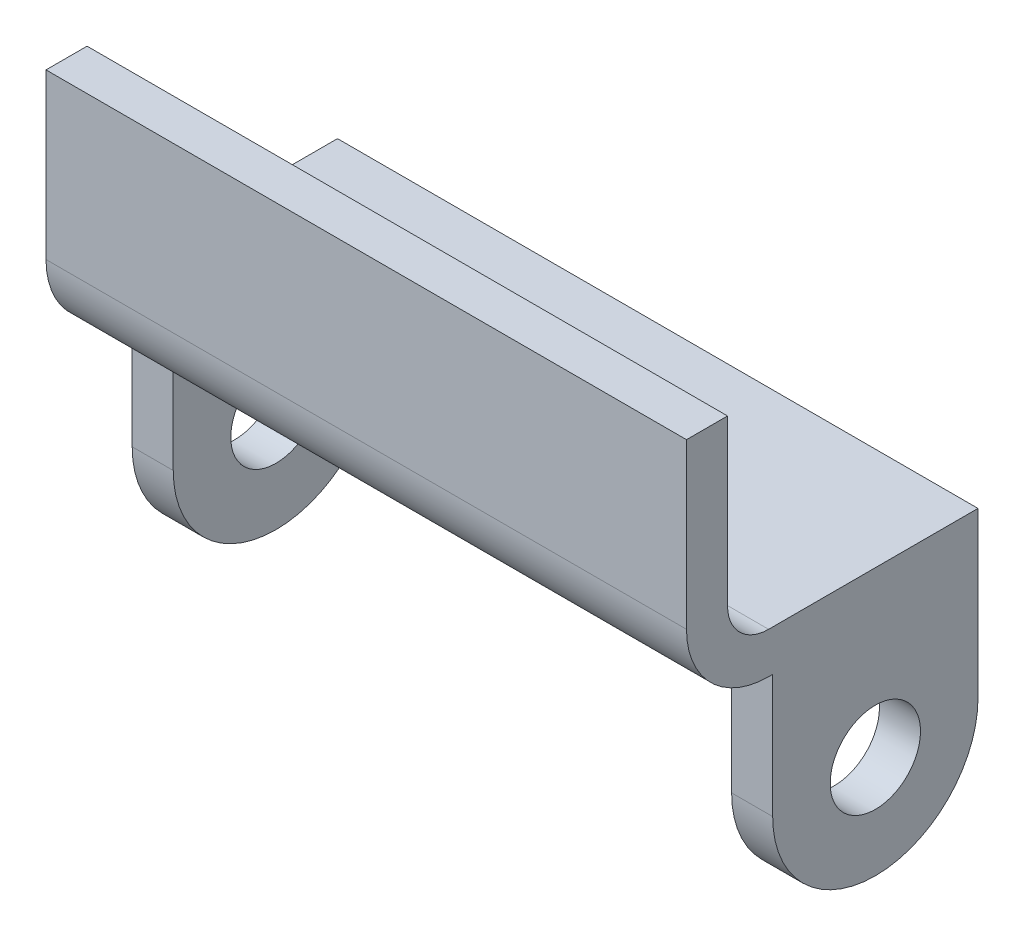
ISO-10303-21;
HEADER;
FILE_DESCRIPTION(('STEP AP214'),'2;1');
FILE_NAME('part.step','',(''),(''),'','','');
FILE_SCHEMA(('AUTOMOTIVE_DESIGN { 1 0 10303 214 1 1 1 1 }'));
ENDSEC;
DATA;
#1=APPLICATION_CONTEXT('core data for automotive mechanical design processes');
#2=APPLICATION_PROTOCOL_DEFINITION('international standard','automotive_design',2000,#1);
#3=PRODUCT_CONTEXT('',#1,'mechanical');
#4=PRODUCT('Part','Part','',(#3));
#5=PRODUCT_RELATED_PRODUCT_CATEGORY('part','',(#4));
#6=PRODUCT_DEFINITION_FORMATION('','',#4);
#7=PRODUCT_DEFINITION_CONTEXT('part definition',#1,'design');
#8=PRODUCT_DEFINITION('design','',#6,#7);
#9=PRODUCT_DEFINITION_SHAPE('','',#8);
#10=(LENGTH_UNIT() NAMED_UNIT(*) SI_UNIT(.MILLI.,.METRE.));
#11=(NAMED_UNIT(*) PLANE_ANGLE_UNIT() SI_UNIT($,.RADIAN.));
#12=(NAMED_UNIT(*) SI_UNIT($,.STERADIAN.) SOLID_ANGLE_UNIT());
#13=UNCERTAINTY_MEASURE_WITH_UNIT(LENGTH_MEASURE(1.E-05),#10,'distance_accuracy_value','');
#14=(GEOMETRIC_REPRESENTATION_CONTEXT(3) GLOBAL_UNCERTAINTY_ASSIGNED_CONTEXT((#13)) GLOBAL_UNIT_ASSIGNED_CONTEXT((#10,
#11,#12)) REPRESENTATION_CONTEXT('',''));
#15=CARTESIAN_POINT('',(0.,0.,0.));
#16=DIRECTION('',(0.,0.,1.));
#17=DIRECTION('',(1.,0.,0.));
#18=AXIS2_PLACEMENT_3D('',#15,#16,#17);
#19=CARTESIAN_POINT('',(39.,-186.635856384961,0.));
#20=DIRECTION('',(0.,1.,0.));
#21=DIRECTION('',(0.,0.,1.));
#22=AXIS2_PLACEMENT_3D('',#19,#20,#21);
#23=PLANE('',#22);
#24=DIRECTION('',(0.,0.,1.));
#25=VECTOR('',#24,1.);
#26=CARTESIAN_POINT('',(-34.,-186.635856384961,0.));
#27=LINE('',#26,#25);
#28=CARTESIAN_POINT('',(-34.,-186.635856384961,-115.093365073489));
#29=VERTEX_POINT('',#28);
#30=CARTESIAN_POINT('',(-34.,-186.635856384961,-90.0887830829173));
#31=VERTEX_POINT('',#30);
#32=EDGE_CURVE('E58',#29,#31,#27,.T.);
#33=ORIENTED_EDGE('',*,*,#32,.F.);
#34=DIRECTION('',(-1.,0.,0.));
#35=VECTOR('',#34,1.);
#36=CARTESIAN_POINT('',(39.,-186.635856384961,-115.093365073489));
#37=LINE('',#36,#35);
#38=CARTESIAN_POINT('',(34.,-186.635856384961,-115.093365073489));
#39=VERTEX_POINT('',#38);
#40=EDGE_CURVE('E161',#39,#29,#37,.T.);
#41=ORIENTED_EDGE('',*,*,#40,.F.);
#42=DIRECTION('',(0.,0.,-1.));
#43=VECTOR('',#42,1.);
#44=CARTESIAN_POINT('',(34.,-186.635856384961,0.));
#45=LINE('',#44,#43);
#46=CARTESIAN_POINT('',(34.,-186.635856384961,-90.0887830829173));
#47=VERTEX_POINT('',#46);
#48=EDGE_CURVE('E259',#47,#39,#45,.T.);
#49=ORIENTED_EDGE('',*,*,#48,.F.);
#50=DIRECTION('',(1.,0.,0.));
#51=VECTOR('',#50,1.);
#52=CARTESIAN_POINT('',(39.,-186.635856384961,-90.0887830829173));
#53=LINE('',#52,#51);
#54=CARTESIAN_POINT('',(39.,-186.635856384961,-90.0887830829173));
#55=VERTEX_POINT('',#54);
#56=EDGE_CURVE('E51',#47,#55,#53,.T.);
#57=ORIENTED_EDGE('',*,*,#56,.T.);
#58=DIRECTION('',(0.,0.,-1.));
#59=VECTOR('',#58,1.);
#60=CARTESIAN_POINT('',(39.,-186.635856384961,0.));
#61=LINE('',#60,#59);
#62=CARTESIAN_POINT('',(39.,-186.635856384961,-89.5933650734886));
#63=VERTEX_POINT('',#62);
#64=EDGE_CURVE('E210',#63,#55,#61,.T.);
#65=ORIENTED_EDGE('',*,*,#64,.F.);
#66=DIRECTION('',(-1.,0.,0.));
#67=VECTOR('',#66,1.);
#68=CARTESIAN_POINT('',(39.,-186.635856384961,-89.5933650734886));
#69=LINE('',#68,#67);
#70=CARTESIAN_POINT('',(-39.,-186.635856384961,-89.5933650734886));
#71=VERTEX_POINT('',#70);
#72=EDGE_CURVE('E255',#63,#71,#69,.T.);
#73=ORIENTED_EDGE('',*,*,#72,.T.);
#74=DIRECTION('',(0.,0.,-1.));
#75=VECTOR('',#74,1.);
#76=CARTESIAN_POINT('',(-39.,-186.635856384961,0.));
#77=LINE('',#76,#75);
#78=CARTESIAN_POINT('',(-39.,-186.635856384961,-90.0887830829173));
#79=VERTEX_POINT('',#78);
#80=EDGE_CURVE('E227',#71,#79,#77,.T.);
#81=ORIENTED_EDGE('',*,*,#80,.T.);
#82=DIRECTION('',(-1.,0.,0.));
#83=VECTOR('',#82,1.);
#84=CARTESIAN_POINT('',(39.,-186.635856384961,-90.0887830829173));
#85=LINE('',#84,#83);
#86=EDGE_CURVE('E11',#31,#79,#85,.T.);
#87=ORIENTED_EDGE('',*,*,#86,.F.);
#88=EDGE_LOOP('',(#33,#41,#49,#57,#65,#73,#81,#87));
#89=FACE_BOUND('',#88,.T.);
#90=ADVANCED_FACE('F43',(#89),#23,.F.);
#91=CARTESIAN_POINT('',(39.,0.,-79.5933650734886));
#92=DIRECTION('',(0.,0.,-1.));
#93=DIRECTION('',(-1.,0.,0.));
#94=AXIS2_PLACEMENT_3D('',#91,#92,#93);
#95=PLANE('',#94);
#96=DIRECTION('',(0.,-1.,0.));
#97=VECTOR('',#96,1.);
#98=CARTESIAN_POINT('',(-39.,0.,-79.5933650734886));
#99=LINE('',#98,#97);
#100=CARTESIAN_POINT('',(-39.,-156.635856384961,-79.5933650734886));
#101=VERTEX_POINT('',#100);
#102=CARTESIAN_POINT('',(-39.,-176.635856384961,-79.5933650734886));
#103=VERTEX_POINT('',#102);
#104=EDGE_CURVE('E197',#101,#103,#99,.T.);
#105=ORIENTED_EDGE('',*,*,#104,.T.);
#106=DIRECTION('',(-1.,0.,0.));
#107=VECTOR('',#106,1.);
#108=CARTESIAN_POINT('',(39.,-176.635856384961,-79.5933650734886));
#109=LINE('',#108,#107);
#110=CARTESIAN_POINT('',(39.,-176.635856384961,-79.5933650734886));
#111=VERTEX_POINT('',#110);
#112=EDGE_CURVE('E253',#111,#103,#109,.T.);
#113=ORIENTED_EDGE('',*,*,#112,.F.);
#114=DIRECTION('',(0.,-1.,0.));
#115=VECTOR('',#114,1.);
#116=CARTESIAN_POINT('',(39.,0.,-79.5933650734886));
#117=LINE('',#116,#115);
#118=CARTESIAN_POINT('',(39.,-156.635856384961,-79.5933650734886));
#119=VERTEX_POINT('',#118);
#120=EDGE_CURVE('E204',#119,#111,#117,.T.);
#121=ORIENTED_EDGE('',*,*,#120,.F.);
#122=DIRECTION('',(-1.,0.,0.));
#123=VECTOR('',#122,1.);
#124=CARTESIAN_POINT('',(39.,-156.635856384961,-79.5933650734886));
#125=LINE('',#124,#123);
#126=EDGE_CURVE('E221',#119,#101,#125,.T.);
#127=ORIENTED_EDGE('',*,*,#126,.T.);
#128=EDGE_LOOP('',(#105,#113,#121,#127));
#129=FACE_BOUND('',#128,.T.);
#130=ADVANCED_FACE('F44',(#129),#95,.F.);
#131=CARTESIAN_POINT('',(39.,-176.635856384961,-89.5933650734886));
#132=DIRECTION('',(-1.,0.,0.));
#133=DIRECTION('',(0.,0.,1.));
#134=AXIS2_PLACEMENT_3D('',#131,#132,#133);
#135=CYLINDRICAL_SURFACE('',#134,10.);
#136=CARTESIAN_POINT('',(-39.,-176.635856384961,-89.5933650734886));
#137=DIRECTION('',(1.,0.,0.));
#138=DIRECTION('',(0.,0.,-1.));
#139=AXIS2_PLACEMENT_3D('',#136,#137,#138);
#140=CIRCLE('',#139,10.);
#141=EDGE_CURVE('E222',#103,#71,#140,.T.);
#142=ORIENTED_EDGE('',*,*,#141,.T.);
#143=ORIENTED_EDGE('',*,*,#72,.F.);
#144=CARTESIAN_POINT('',(39.,-176.635856384961,-89.5933650734886));
#145=DIRECTION('',(1.,0.,0.));
#146=DIRECTION('',(0.,0.,-1.));
#147=AXIS2_PLACEMENT_3D('',#144,#145,#146);
#148=CIRCLE('',#147,10.);
#149=EDGE_CURVE('E203',#111,#63,#148,.T.);
#150=ORIENTED_EDGE('',*,*,#149,.F.);
#151=ORIENTED_EDGE('',*,*,#112,.T.);
#152=EDGE_LOOP('',(#142,#143,#150,#151));
#153=FACE_BOUND('',#152,.T.);
#154=ADVANCED_FACE('F305',(#153),#135,.T.);
#155=CARTESIAN_POINT('',(39.,0.,-115.093365073489));
#156=DIRECTION('',(0.,0.,-1.));
#157=DIRECTION('',(-1.,0.,0.));
#158=AXIS2_PLACEMENT_3D('',#155,#156,#157);
#159=PLANE('',#158);
#160=DIRECTION('',(0.,-1.,0.));
#161=VECTOR('',#160,1.);
#162=CARTESIAN_POINT('',(-39.,0.,-115.093365073489));
#163=LINE('',#162,#161);
#164=CARTESIAN_POINT('',(-39.,-181.635856384961,-115.093365073489));
#165=VERTEX_POINT('',#164);
#166=CARTESIAN_POINT('',(-39.,-201.635856384961,-115.093365073489));
#167=VERTEX_POINT('',#166);
#168=EDGE_CURVE('E230',#165,#167,#163,.T.);
#169=ORIENTED_EDGE('',*,*,#168,.F.);
#170=DIRECTION('',(-1.,0.,0.));
#171=VECTOR('',#170,1.);
#172=CARTESIAN_POINT('',(39.,-181.635856384961,-115.093365073489));
#173=LINE('',#172,#171);
#174=CARTESIAN_POINT('',(39.,-181.635856384961,-115.093365073489));
#175=VERTEX_POINT('',#174);
#176=EDGE_CURVE('E248',#175,#165,#173,.T.);
#177=ORIENTED_EDGE('',*,*,#176,.F.);
#178=DIRECTION('',(0.,-1.,0.));
#179=VECTOR('',#178,1.);
#180=CARTESIAN_POINT('',(39.,0.,-115.093365073489));
#181=LINE('',#180,#179);
#182=CARTESIAN_POINT('',(39.,-201.635856384961,-115.093365073489));
#183=VERTEX_POINT('',#182);
#184=EDGE_CURVE('E208',#175,#183,#181,.T.);
#185=ORIENTED_EDGE('',*,*,#184,.T.);
#186=DIRECTION('',(1.,0.,0.));
#187=VECTOR('',#186,1.);
#188=CARTESIAN_POINT('',(34.,-201.635856384961,-115.093365073489));
#189=LINE('',#188,#187);
#190=CARTESIAN_POINT('',(34.,-201.635856384961,-115.093365073489));
#191=VERTEX_POINT('',#190);
#192=EDGE_CURVE('E193',#191,#183,#189,.T.);
#193=ORIENTED_EDGE('',*,*,#192,.F.);
#194=DIRECTION('',(0.,1.,0.));
#195=VECTOR('',#194,1.);
#196=CARTESIAN_POINT('',(34.,-181.635856384961,-115.093365073489));
#197=LINE('',#196,#195);
#198=EDGE_CURVE('E186',#191,#39,#197,.T.);
#199=ORIENTED_EDGE('',*,*,#198,.T.);
#200=ORIENTED_EDGE('',*,*,#40,.T.);
#201=DIRECTION('',(0.,1.,0.));
#202=VECTOR('',#201,1.);
#203=CARTESIAN_POINT('',(-34.,-181.635856384961,-115.093365073489));
#204=LINE('',#203,#202);
#205=CARTESIAN_POINT('',(-34.,-201.635856384961,-115.093365073489));
#206=VERTEX_POINT('',#205);
#207=EDGE_CURVE('E144',#206,#29,#204,.T.);
#208=ORIENTED_EDGE('',*,*,#207,.F.);
#209=DIRECTION('',(-1.,0.,0.));
#210=VECTOR('',#209,1.);
#211=CARTESIAN_POINT('',(-34.,-201.635856384961,-115.093365073489));
#212=LINE('',#211,#210);
#213=EDGE_CURVE('E152',#206,#167,#212,.T.);
#214=ORIENTED_EDGE('',*,*,#213,.T.);
#215=EDGE_LOOP('',(#169,#177,#185,#193,#199,#200,#208,#214));
#216=FACE_BOUND('',#215,.T.);
#217=ADVANCED_FACE('F163',(#216),#159,.T.);
#218=CARTESIAN_POINT('',(39.,-181.635856384961,0.));
#219=DIRECTION('',(0.,1.,0.));
#220=DIRECTION('',(0.,0.,1.));
#221=AXIS2_PLACEMENT_3D('',#218,#219,#220);
#222=PLANE('',#221);
#223=ORIENTED_EDGE('',*,*,#176,.T.);
#224=DIRECTION('',(0.,0.,-1.));
#225=VECTOR('',#224,1.);
#226=CARTESIAN_POINT('',(-39.,-181.635856384961,0.));
#227=LINE('',#226,#225);
#228=CARTESIAN_POINT('',(-39.,-181.635856384961,-89.5933650734886));
#229=VERTEX_POINT('',#228);
#230=EDGE_CURVE('E233',#229,#165,#227,.T.);
#231=ORIENTED_EDGE('',*,*,#230,.F.);
#232=DIRECTION('',(-1.,0.,0.));
#233=VECTOR('',#232,1.);
#234=CARTESIAN_POINT('',(39.,-181.635856384961,-89.5933650734886));
#235=LINE('',#234,#233);
#236=CARTESIAN_POINT('',(39.,-181.635856384961,-89.5933650734886));
#237=VERTEX_POINT('',#236);
#238=EDGE_CURVE('E250',#237,#229,#235,.T.);
#239=ORIENTED_EDGE('',*,*,#238,.F.);
#240=DIRECTION('',(0.,0.,-1.));
#241=VECTOR('',#240,1.);
#242=CARTESIAN_POINT('',(39.,-181.635856384961,0.));
#243=LINE('',#242,#241);
#244=EDGE_CURVE('E215',#237,#175,#243,.T.);
#245=ORIENTED_EDGE('',*,*,#244,.T.);
#246=EDGE_LOOP('',(#223,#231,#239,#245));
#247=FACE_BOUND('',#246,.T.);
#248=ADVANCED_FACE('F281',(#247),#222,.T.);
#249=CARTESIAN_POINT('',(39.,-176.635856384961,-89.5933650734886));
#250=DIRECTION('',(-1.,0.,0.));
#251=DIRECTION('',(0.,0.,1.));
#252=AXIS2_PLACEMENT_3D('',#249,#250,#251);
#253=CYLINDRICAL_SURFACE('',#252,5.);
#254=CARTESIAN_POINT('',(-39.,-176.635856384961,-89.5933650734886));
#255=DIRECTION('',(1.,0.,0.));
#256=DIRECTION('',(0.,0.,-1.));
#257=AXIS2_PLACEMENT_3D('',#254,#255,#256);
#258=CIRCLE('',#257,5.);
#259=CARTESIAN_POINT('',(-39.,-176.635856384961,-84.5933650734886));
#260=VERTEX_POINT('',#259);
#261=EDGE_CURVE('E234',#260,#229,#258,.T.);
#262=ORIENTED_EDGE('',*,*,#261,.F.);
#263=DIRECTION('',(-1.,0.,0.));
#264=VECTOR('',#263,1.);
#265=CARTESIAN_POINT('',(39.,-176.635856384961,-84.5933650734886));
#266=LINE('',#265,#264);
#267=CARTESIAN_POINT('',(39.,-176.635856384961,-84.5933650734886));
#268=VERTEX_POINT('',#267);
#269=EDGE_CURVE('E244',#268,#260,#266,.T.);
#270=ORIENTED_EDGE('',*,*,#269,.F.);
#271=CARTESIAN_POINT('',(39.,-176.635856384961,-89.5933650734886));
#272=DIRECTION('',(1.,0.,0.));
#273=DIRECTION('',(0.,0.,-1.));
#274=AXIS2_PLACEMENT_3D('',#271,#272,#273);
#275=CIRCLE('',#274,5.);
#276=EDGE_CURVE('E211',#268,#237,#275,.T.);
#277=ORIENTED_EDGE('',*,*,#276,.T.);
#278=ORIENTED_EDGE('',*,*,#238,.T.);
#279=EDGE_LOOP('',(#262,#270,#277,#278));
#280=FACE_BOUND('',#279,.T.);
#281=ADVANCED_FACE('F288',(#280),#253,.F.);
#282=CARTESIAN_POINT('',(39.,0.,-84.5933650734885));
#283=DIRECTION('',(0.,0.,-1.));
#284=DIRECTION('',(0.,1.,0.));
#285=AXIS2_PLACEMENT_3D('',#282,#283,#284);
#286=PLANE('',#285);
#287=DIRECTION('',(0.,-1.,0.));
#288=VECTOR('',#287,1.);
#289=CARTESIAN_POINT('',(-39.,0.,-84.5933650734885));
#290=LINE('',#289,#288);
#291=CARTESIAN_POINT('',(-39.,-156.635856384961,-84.5933650734886));
#292=VERTEX_POINT('',#291);
#293=EDGE_CURVE('E240',#292,#260,#290,.T.);
#294=ORIENTED_EDGE('',*,*,#293,.F.);
#295=DIRECTION('',(-1.,0.,0.));
#296=VECTOR('',#295,1.);
#297=CARTESIAN_POINT('',(39.,-156.635856384961,-84.5933650734886));
#298=LINE('',#297,#296);
#299=CARTESIAN_POINT('',(39.,-156.635856384961,-84.5933650734886));
#300=VERTEX_POINT('',#299);
#301=EDGE_CURVE('E243',#300,#292,#298,.T.);
#302=ORIENTED_EDGE('',*,*,#301,.F.);
#303=DIRECTION('',(0.,-1.,0.));
#304=VECTOR('',#303,1.);
#305=CARTESIAN_POINT('',(39.,0.,-84.5933650734885));
#306=LINE('',#305,#304);
#307=EDGE_CURVE('E220',#300,#268,#306,.T.);
#308=ORIENTED_EDGE('',*,*,#307,.T.);
#309=ORIENTED_EDGE('',*,*,#269,.T.);
#310=EDGE_LOOP('',(#294,#302,#308,#309));
#311=FACE_BOUND('',#310,.T.);
#312=ADVANCED_FACE('F292',(#311),#286,.T.);
#313=CARTESIAN_POINT('',(39.,-156.635856384961,0.));
#314=DIRECTION('',(0.,-1.,0.));
#315=DIRECTION('',(0.,0.,-1.));
#316=AXIS2_PLACEMENT_3D('',#313,#314,#315);
#317=PLANE('',#316);
#318=DIRECTION('',(0.,0.,1.));
#319=VECTOR('',#318,1.);
#320=CARTESIAN_POINT('',(-39.,-156.635856384961,0.));
#321=LINE('',#320,#319);
#322=EDGE_CURVE('E202',#292,#101,#321,.T.);
#323=ORIENTED_EDGE('',*,*,#322,.T.);
#324=ORIENTED_EDGE('',*,*,#126,.F.);
#325=DIRECTION('',(0.,0.,1.));
#326=VECTOR('',#325,1.);
#327=CARTESIAN_POINT('',(39.,-156.635856384961,0.));
#328=LINE('',#327,#326);
#329=EDGE_CURVE('E219',#300,#119,#328,.T.);
#330=ORIENTED_EDGE('',*,*,#329,.F.);
#331=ORIENTED_EDGE('',*,*,#301,.T.);
#332=EDGE_LOOP('',(#323,#324,#330,#331));
#333=FACE_BOUND('',#332,.T.);
#334=ADVANCED_FACE('F298',(#333),#317,.F.);
#335=CARTESIAN_POINT('',(39.,0.,0.));
#336=DIRECTION('',(1.,0.,0.));
#337=DIRECTION('',(0.,0.,-1.));
#338=AXIS2_PLACEMENT_3D('',#335,#336,#337);
#339=PLANE('',#338);
#340=ORIENTED_EDGE('',*,*,#64,.T.);
#341=DIRECTION('',(0.,-1.,0.));
#342=VECTOR('',#341,1.);
#343=CARTESIAN_POINT('',(39.,-181.635856384961,-90.0887830829173));
#344=LINE('',#343,#342);
#345=CARTESIAN_POINT('',(39.,-201.635856384961,-90.0887830829173));
#346=VERTEX_POINT('',#345);
#347=EDGE_CURVE('E179',#55,#346,#344,.T.);
#348=ORIENTED_EDGE('',*,*,#347,.T.);
#349=CARTESIAN_POINT('',(39.,-201.635856384961,-102.591074078203));
#350=DIRECTION('',(1.,0.,0.));
#351=DIRECTION('',(0.,0.,-1.));
#352=AXIS2_PLACEMENT_3D('',#349,#350,#351);
#353=CIRCLE('',#352,12.5022909952857);
#354=EDGE_CURVE('E187',#346,#183,#353,.T.);
#355=ORIENTED_EDGE('',*,*,#354,.T.);
#356=ORIENTED_EDGE('',*,*,#184,.F.);
#357=ORIENTED_EDGE('',*,*,#244,.F.);
#358=ORIENTED_EDGE('',*,*,#276,.F.);
#359=ORIENTED_EDGE('',*,*,#307,.F.);
#360=ORIENTED_EDGE('',*,*,#329,.T.);
#361=ORIENTED_EDGE('',*,*,#120,.T.);
#362=ORIENTED_EDGE('',*,*,#149,.T.);
#363=EDGE_LOOP('',(#340,#348,#355,#356,#357,#358,#359,#360,#361,#362));
#364=FACE_BOUND('',#363,.T.);
#365=CARTESIAN_POINT('',(39.,-201.635856384961,-102.591074078203));
#366=DIRECTION('',(1.,0.,0.));
#367=DIRECTION('',(0.,0.,-1.));
#368=AXIS2_PLACEMENT_3D('',#365,#366,#367);
#369=CIRCLE('',#368,5.50000000000002);
#370=CARTESIAN_POINT('',(39.,-201.635856384961,-108.091074078203));
#371=VERTEX_POINT('',#370);
#372=EDGE_CURVE('E176',#371,#371,#369,.T.);
#373=ORIENTED_EDGE('',*,*,#372,.F.);
#374=EDGE_LOOP('',(#373));
#375=FACE_BOUND('',#374,.T.);
#376=ADVANCED_FACE('F269',(#364,#375),#339,.T.);
#377=CARTESIAN_POINT('',(-39.,0.,0.));
#378=DIRECTION('',(1.,0.,0.));
#379=DIRECTION('',(0.,0.,-1.));
#380=AXIS2_PLACEMENT_3D('',#377,#378,#379);
#381=PLANE('',#380);
#382=ORIENTED_EDGE('',*,*,#230,.T.);
#383=ORIENTED_EDGE('',*,*,#168,.T.);
#384=CARTESIAN_POINT('',(-39.,-201.635856384961,-102.591074078203));
#385=DIRECTION('',(1.,0.,0.));
#386=DIRECTION('',(0.,0.,-1.));
#387=AXIS2_PLACEMENT_3D('',#384,#385,#386);
#388=CIRCLE('',#387,12.5022909952857);
#389=CARTESIAN_POINT('',(-39.,-201.635856384961,-90.0887830829173));
#390=VERTEX_POINT('',#389);
#391=EDGE_CURVE('E159',#390,#167,#388,.T.);
#392=ORIENTED_EDGE('',*,*,#391,.F.);
#393=DIRECTION('',(0.,-1.,0.));
#394=VECTOR('',#393,1.);
#395=CARTESIAN_POINT('',(-39.,-181.635856384961,-90.0887830829173));
#396=LINE('',#395,#394);
#397=EDGE_CURVE('E165',#79,#390,#396,.T.);
#398=ORIENTED_EDGE('',*,*,#397,.F.);
#399=ORIENTED_EDGE('',*,*,#80,.F.);
#400=ORIENTED_EDGE('',*,*,#141,.F.);
#401=ORIENTED_EDGE('',*,*,#104,.F.);
#402=ORIENTED_EDGE('',*,*,#322,.F.);
#403=ORIENTED_EDGE('',*,*,#293,.T.);
#404=ORIENTED_EDGE('',*,*,#261,.T.);
#405=EDGE_LOOP('',(#382,#383,#392,#398,#399,#400,#401,#402,#403,#404));
#406=FACE_BOUND('',#405,.T.);
#407=CARTESIAN_POINT('',(-39.,-201.635856384961,-102.591074078203));
#408=DIRECTION('',(1.,0.,0.));
#409=DIRECTION('',(0.,0.,-1.));
#410=AXIS2_PLACEMENT_3D('',#407,#408,#409);
#411=CIRCLE('',#410,5.50000000000002);
#412=CARTESIAN_POINT('',(-39.,-201.635856384961,-108.091074078203));
#413=VERTEX_POINT('',#412);
#414=EDGE_CURVE('E166',#413,#413,#411,.T.);
#415=ORIENTED_EDGE('',*,*,#414,.T.);
#416=EDGE_LOOP('',(#415));
#417=FACE_BOUND('',#416,.T.);
#418=ADVANCED_FACE('F282',(#406,#417),#381,.F.);
#419=CARTESIAN_POINT('',(34.,-181.635856384961,-90.0887830829173));
#420=DIRECTION('',(0.,0.,1.));
#421=DIRECTION('',(1.,0.,0.));
#422=AXIS2_PLACEMENT_3D('',#419,#420,#421);
#423=PLANE('',#422);
#424=ORIENTED_EDGE('',*,*,#56,.F.);
#425=DIRECTION('',(0.,-1.,0.));
#426=VECTOR('',#425,1.);
#427=CARTESIAN_POINT('',(34.,-181.635856384961,-90.0887830829173));
#428=LINE('',#427,#426);
#429=CARTESIAN_POINT('',(34.,-201.635856384961,-90.0887830829173));
#430=VERTEX_POINT('',#429);
#431=EDGE_CURVE('E182',#47,#430,#428,.T.);
#432=ORIENTED_EDGE('',*,*,#431,.T.);
#433=DIRECTION('',(1.,0.,0.));
#434=VECTOR('',#433,1.);
#435=CARTESIAN_POINT('',(34.,-201.635856384961,-90.0887830829173));
#436=LINE('',#435,#434);
#437=EDGE_CURVE('E192',#430,#346,#436,.T.);
#438=ORIENTED_EDGE('',*,*,#437,.T.);
#439=ORIENTED_EDGE('',*,*,#347,.F.);
#440=EDGE_LOOP('',(#424,#432,#438,#439));
#441=FACE_BOUND('',#440,.T.);
#442=ADVANCED_FACE('F268',(#441),#423,.T.);
#443=CARTESIAN_POINT('',(34.,-201.635856384961,-102.591074078203));
#444=DIRECTION('',(1.,0.,0.));
#445=DIRECTION('',(0.,0.,-1.));
#446=AXIS2_PLACEMENT_3D('',#443,#444,#445);
#447=PLANE('',#446);
#448=CARTESIAN_POINT('',(34.,-201.635856384961,-102.591074078203));
#449=DIRECTION('',(1.,0.,0.));
#450=DIRECTION('',(0.,0.,-1.));
#451=AXIS2_PLACEMENT_3D('',#448,#449,#450);
#452=CIRCLE('',#451,5.50000000000002);
#453=CARTESIAN_POINT('',(34.,-201.635856384961,-108.091074078203));
#454=VERTEX_POINT('',#453);
#455=EDGE_CURVE('E180',#454,#454,#452,.T.);
#456=ORIENTED_EDGE('',*,*,#455,.T.);
#457=EDGE_LOOP('',(#456));
#458=FACE_BOUND('',#457,.T.);
#459=ORIENTED_EDGE('',*,*,#431,.F.);
#460=ORIENTED_EDGE('',*,*,#48,.T.);
#461=ORIENTED_EDGE('',*,*,#198,.F.);
#462=CARTESIAN_POINT('',(34.,-201.635856384961,-102.591074078203));
#463=DIRECTION('',(1.,0.,0.));
#464=DIRECTION('',(0.,0.,-1.));
#465=AXIS2_PLACEMENT_3D('',#462,#463,#464);
#466=CIRCLE('',#465,12.5022909952857);
#467=EDGE_CURVE('E184',#430,#191,#466,.T.);
#468=ORIENTED_EDGE('',*,*,#467,.F.);
#469=EDGE_LOOP('',(#459,#460,#461,#468));
#470=FACE_BOUND('',#469,.T.);
#471=ADVANCED_FACE('F347',(#458,#470),#447,.F.);
#472=CARTESIAN_POINT('',(34.,-201.635856384961,-102.591074078203));
#473=DIRECTION('',(1.,0.,0.));
#474=DIRECTION('',(0.,0.,-1.));
#475=AXIS2_PLACEMENT_3D('',#472,#473,#474);
#476=CYLINDRICAL_SURFACE('',#475,12.5022909952857);
#477=ORIENTED_EDGE('',*,*,#354,.F.);
#478=ORIENTED_EDGE('',*,*,#437,.F.);
#479=ORIENTED_EDGE('',*,*,#467,.T.);
#480=ORIENTED_EDGE('',*,*,#192,.T.);
#481=EDGE_LOOP('',(#477,#478,#479,#480));
#482=FACE_BOUND('',#481,.T.);
#483=ADVANCED_FACE('F274',(#482),#476,.T.);
#484=CARTESIAN_POINT('',(34.,-201.635856384961,-102.591074078203));
#485=DIRECTION('',(1.,0.,0.));
#486=DIRECTION('',(0.,0.,-1.));
#487=AXIS2_PLACEMENT_3D('',#484,#485,#486);
#488=CYLINDRICAL_SURFACE('',#487,5.50000000000002);
#489=ORIENTED_EDGE('',*,*,#455,.F.);
#490=EDGE_LOOP('',(#489));
#491=FACE_BOUND('',#490,.T.);
#492=ORIENTED_EDGE('',*,*,#372,.T.);
#493=EDGE_LOOP('',(#492));
#494=FACE_BOUND('',#493,.T.);
#495=ADVANCED_FACE('F308',(#491,#494),#488,.F.);
#496=CARTESIAN_POINT('',(-34.,-181.635856384961,-90.0887830829173));
#497=DIRECTION('',(0.,0.,-1.));
#498=DIRECTION('',(-1.,0.,0.));
#499=AXIS2_PLACEMENT_3D('',#496,#497,#498);
#500=PLANE('',#499);
#501=DIRECTION('',(0.,-1.,0.));
#502=VECTOR('',#501,1.);
#503=CARTESIAN_POINT('',(-34.,-181.635856384961,-90.0887830829173));
#504=LINE('',#503,#502);
#505=CARTESIAN_POINT('',(-34.,-201.635856384961,-90.0887830829173));
#506=VERTEX_POINT('',#505);
#507=EDGE_CURVE('E147',#31,#506,#504,.T.);
#508=ORIENTED_EDGE('',*,*,#507,.F.);
#509=ORIENTED_EDGE('',*,*,#86,.T.);
#510=ORIENTED_EDGE('',*,*,#397,.T.);
#511=DIRECTION('',(-1.,0.,0.));
#512=VECTOR('',#511,1.);
#513=CARTESIAN_POINT('',(-34.,-201.635856384961,-90.0887830829173));
#514=LINE('',#513,#512);
#515=EDGE_CURVE('E158',#506,#390,#514,.T.);
#516=ORIENTED_EDGE('',*,*,#515,.F.);
#517=EDGE_LOOP('',(#508,#509,#510,#516));
#518=FACE_BOUND('',#517,.T.);
#519=ADVANCED_FACE('F306',(#518),#500,.F.);
#520=CARTESIAN_POINT('',(-34.,-201.635856384961,-102.591074078203));
#521=DIRECTION('',(-1.,0.,0.));
#522=DIRECTION('',(0.,0.,-1.));
#523=AXIS2_PLACEMENT_3D('',#520,#521,#522);
#524=PLANE('',#523);
#525=CARTESIAN_POINT('',(-34.,-201.635856384961,-102.591074078203));
#526=DIRECTION('',(1.,0.,0.));
#527=DIRECTION('',(0.,0.,-1.));
#528=AXIS2_PLACEMENT_3D('',#525,#526,#527);
#529=CIRCLE('',#528,5.50000000000002);
#530=CARTESIAN_POINT('',(-34.,-201.635856384961,-108.091074078203));
#531=VERTEX_POINT('',#530);
#532=EDGE_CURVE('E175',#531,#531,#529,.T.);
#533=ORIENTED_EDGE('',*,*,#532,.F.);
#534=EDGE_LOOP('',(#533));
#535=FACE_BOUND('',#534,.T.);
#536=ORIENTED_EDGE('',*,*,#207,.T.);
#537=ORIENTED_EDGE('',*,*,#32,.T.);
#538=ORIENTED_EDGE('',*,*,#507,.T.);
#539=CARTESIAN_POINT('',(-34.,-201.635856384961,-102.591074078203));
#540=DIRECTION('',(1.,0.,0.));
#541=DIRECTION('',(0.,0.,-1.));
#542=AXIS2_PLACEMENT_3D('',#539,#540,#541);
#543=CIRCLE('',#542,12.5022909952857);
#544=EDGE_CURVE('E137',#506,#206,#543,.T.);
#545=ORIENTED_EDGE('',*,*,#544,.T.);
#546=EDGE_LOOP('',(#536,#537,#538,#545));
#547=FACE_BOUND('',#546,.T.);
#548=ADVANCED_FACE('F145',(#535,#547),#524,.F.);
#549=CARTESIAN_POINT('',(-34.,-201.635856384961,-102.591074078203));
#550=DIRECTION('',(-1.,0.,0.));
#551=DIRECTION('',(0.,0.,1.));
#552=AXIS2_PLACEMENT_3D('',#549,#550,#551);
#553=CYLINDRICAL_SURFACE('',#552,12.5022909952857);
#554=ORIENTED_EDGE('',*,*,#391,.T.);
#555=ORIENTED_EDGE('',*,*,#213,.F.);
#556=ORIENTED_EDGE('',*,*,#544,.F.);
#557=ORIENTED_EDGE('',*,*,#515,.T.);
#558=EDGE_LOOP('',(#554,#555,#556,#557));
#559=FACE_BOUND('',#558,.T.);
#560=ADVANCED_FACE('F153',(#559),#553,.T.);
#561=CARTESIAN_POINT('',(-34.,-201.635856384961,-102.591074078203));
#562=DIRECTION('',(-1.,0.,0.));
#563=DIRECTION('',(0.,0.,1.));
#564=AXIS2_PLACEMENT_3D('',#561,#562,#563);
#565=CYLINDRICAL_SURFACE('',#564,5.50000000000002);
#566=ORIENTED_EDGE('',*,*,#532,.T.);
#567=EDGE_LOOP('',(#566));
#568=FACE_BOUND('',#567,.T.);
#569=ORIENTED_EDGE('',*,*,#414,.F.);
#570=EDGE_LOOP('',(#569));
#571=FACE_BOUND('',#570,.T.);
#572=ADVANCED_FACE('F353',(#568,#571),#565,.F.);
#573=CLOSED_SHELL('',(#90,#130,#154,#217,#248,#281,#312,#334,#376,#418,#442,#471,#483,#495,#519,
#548,#560,#572));
#574=MANIFOLD_SOLID_BREP('B2',#573);
#575=ADVANCED_BREP_SHAPE_REPRESENTATION('',(#18,#574),#14);
#576=SHAPE_DEFINITION_REPRESENTATION(#9,#575);
ENDSEC;
END-ISO-10303-21;
